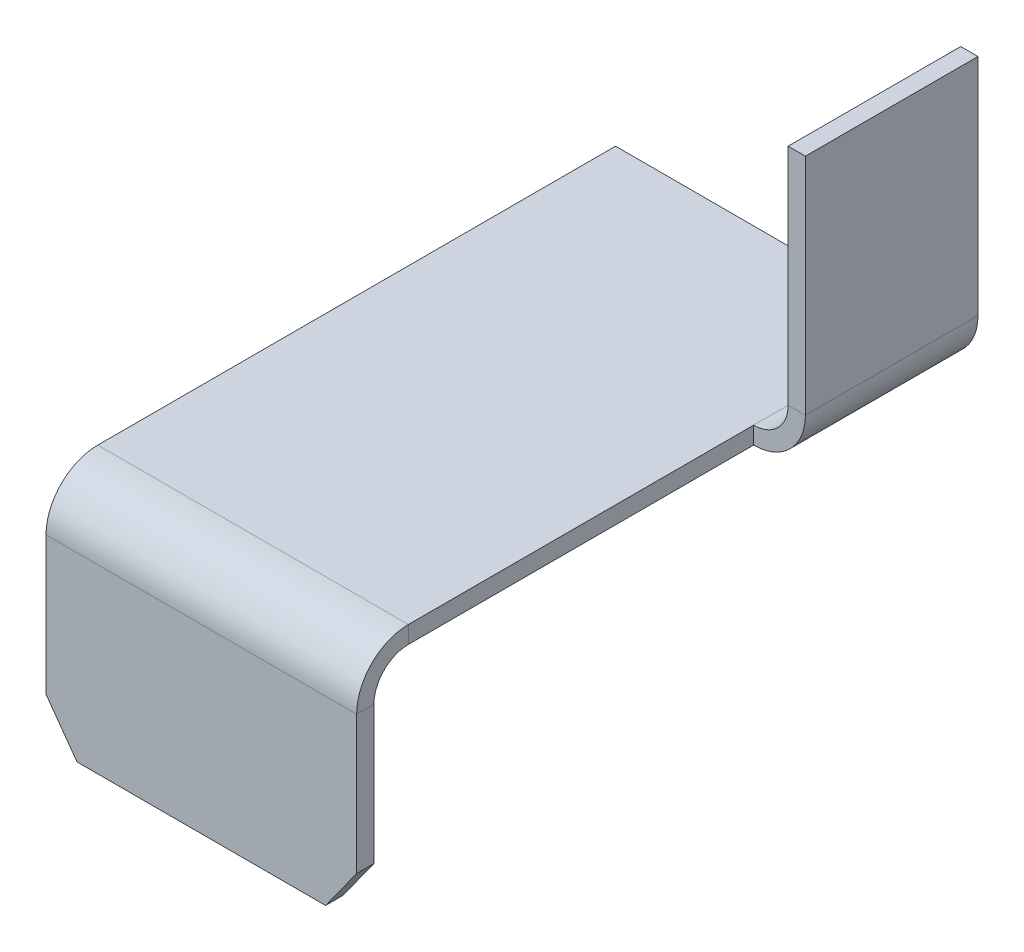
ISO-10303-21;
HEADER;
FILE_DESCRIPTION(('STEP AP214'),'2;1');
FILE_NAME('part.step','',(''),(''),'','','');
FILE_SCHEMA(('AUTOMOTIVE_DESIGN { 1 0 10303 214 1 1 1 1 }'));
ENDSEC;
DATA;
#1=APPLICATION_CONTEXT('core data for automotive mechanical design processes');
#2=APPLICATION_PROTOCOL_DEFINITION('international standard','automotive_design',2000,#1);
#3=PRODUCT_CONTEXT('',#1,'mechanical');
#4=PRODUCT('Part','Part','',(#3));
#5=PRODUCT_RELATED_PRODUCT_CATEGORY('part','',(#4));
#6=PRODUCT_DEFINITION_FORMATION('','',#4);
#7=PRODUCT_DEFINITION_CONTEXT('part definition',#1,'design');
#8=PRODUCT_DEFINITION('design','',#6,#7);
#9=PRODUCT_DEFINITION_SHAPE('','',#8);
#10=(LENGTH_UNIT() NAMED_UNIT(*) SI_UNIT(.MILLI.,.METRE.));
#11=(NAMED_UNIT(*) PLANE_ANGLE_UNIT() SI_UNIT($,.RADIAN.));
#12=(NAMED_UNIT(*) SI_UNIT($,.STERADIAN.) SOLID_ANGLE_UNIT());
#13=UNCERTAINTY_MEASURE_WITH_UNIT(LENGTH_MEASURE(1.E-05),#10,'distance_accuracy_value','');
#14=(GEOMETRIC_REPRESENTATION_CONTEXT(3) GLOBAL_UNCERTAINTY_ASSIGNED_CONTEXT((#13)) GLOBAL_UNIT_ASSIGNED_CONTEXT((#10,
#11,#12)) REPRESENTATION_CONTEXT('',''));
#15=CARTESIAN_POINT('',(0.,0.,0.));
#16=DIRECTION('',(0.,0.,1.));
#17=DIRECTION('',(1.,0.,0.));
#18=AXIS2_PLACEMENT_3D('',#15,#16,#17);
#19=CARTESIAN_POINT('',(20.,2.,10.));
#20=DIRECTION('',(0.,0.,1.));
#21=DIRECTION('',(1.,0.,0.));
#22=AXIS2_PLACEMENT_3D('',#19,#20,#21);
#23=PLANE('',#22);
#24=DIRECTION('',(1.,0.,0.));
#25=VECTOR('',#24,1.);
#26=CARTESIAN_POINT('',(20.,2.,10.));
#27=LINE('',#26,#25);
#28=CARTESIAN_POINT('',(20.,2.,10.));
#29=VERTEX_POINT('',#28);
#30=CARTESIAN_POINT('',(21.,2.,10.));
#31=VERTEX_POINT('',#30);
#32=EDGE_CURVE('E13',#29,#31,#27,.T.);
#33=ORIENTED_EDGE('',*,*,#32,.F.);
#34=CARTESIAN_POINT('',(18.,2.,10.));
#35=DIRECTION('',(0.,0.,-1.));
#36=DIRECTION('',(-1.,0.,0.));
#37=AXIS2_PLACEMENT_3D('',#34,#35,#36);
#38=CIRCLE('',#37,2.);
#39=CARTESIAN_POINT('',(18.,0.,10.));
#40=VERTEX_POINT('',#39);
#41=EDGE_CURVE('E270',#40,#29,#38,.F.);
#42=ORIENTED_EDGE('',*,*,#41,.F.);
#43=DIRECTION('',(0.,1.,0.));
#44=VECTOR('',#43,1.);
#45=CARTESIAN_POINT('',(18.,-1.,10.));
#46=LINE('',#45,#44);
#47=CARTESIAN_POINT('',(18.,-0.999999999999997,10.));
#48=VERTEX_POINT('',#47);
#49=EDGE_CURVE('E78',#48,#40,#46,.T.);
#50=ORIENTED_EDGE('',*,*,#49,.F.);
#51=CARTESIAN_POINT('',(18.,2.,10.));
#52=DIRECTION('',(0.,0.,1.));
#53=DIRECTION('',(1.,0.,0.));
#54=AXIS2_PLACEMENT_3D('',#51,#52,#53);
#55=CIRCLE('',#54,3.);
#56=EDGE_CURVE('E269',#48,#31,#55,.T.);
#57=ORIENTED_EDGE('',*,*,#56,.T.);
#58=EDGE_LOOP('',(#33,#42,#50,#57));
#59=FACE_BOUND('',#58,.T.);
#60=ADVANCED_FACE('F72',(#59),#23,.T.);
#61=CARTESIAN_POINT('',(18.,-1.,10.));
#62=DIRECTION('',(0.,0.,1.));
#63=DIRECTION('',(1.,0.,0.));
#64=AXIS2_PLACEMENT_3D('',#61,#62,#63);
#65=PLANE('',#64);
#66=DIRECTION('',(0.,1.,0.));
#67=VECTOR('',#66,1.);
#68=CARTESIAN_POINT('',(20.,0.,10.));
#69=LINE('',#68,#67);
#70=CARTESIAN_POINT('',(20.,15.,10.));
#71=VERTEX_POINT('',#70);
#72=EDGE_CURVE('E262',#29,#71,#69,.T.);
#73=ORIENTED_EDGE('',*,*,#72,.F.);
#74=ORIENTED_EDGE('',*,*,#32,.T.);
#75=DIRECTION('',(0.,1.,0.));
#76=VECTOR('',#75,1.);
#77=CARTESIAN_POINT('',(21.,0.,10.));
#78=LINE('',#77,#76);
#79=CARTESIAN_POINT('',(21.,15.,10.));
#80=VERTEX_POINT('',#79);
#81=EDGE_CURVE('E127',#31,#80,#78,.T.);
#82=ORIENTED_EDGE('',*,*,#81,.T.);
#83=DIRECTION('',(1.,0.,0.));
#84=VECTOR('',#83,1.);
#85=CARTESIAN_POINT('',(20.,15.,10.));
#86=LINE('',#85,#84);
#87=EDGE_CURVE('E257',#71,#80,#86,.T.);
#88=ORIENTED_EDGE('',*,*,#87,.F.);
#89=EDGE_LOOP('',(#73,#74,#82,#88));
#90=FACE_BOUND('',#89,.T.);
#91=ADVANCED_FACE('F334',(#90),#65,.T.);
#92=CARTESIAN_POINT('',(18.,0.,0.));
#93=DIRECTION('',(0.,0.,-1.));
#94=DIRECTION('',(-1.,0.,0.));
#95=AXIS2_PLACEMENT_3D('',#92,#93,#94);
#96=PLANE('',#95);
#97=DIRECTION('',(0.,-1.,0.));
#98=VECTOR('',#97,1.);
#99=CARTESIAN_POINT('',(18.,0.,0.));
#100=LINE('',#99,#98);
#101=CARTESIAN_POINT('',(18.,0.,0.));
#102=VERTEX_POINT('',#101);
#103=CARTESIAN_POINT('',(18.,-1.,0.));
#104=VERTEX_POINT('',#103);
#105=EDGE_CURVE('E111',#102,#104,#100,.T.);
#106=ORIENTED_EDGE('',*,*,#105,.F.);
#107=CARTESIAN_POINT('',(18.,2.,0.));
#108=DIRECTION('',(0.,0.,-1.));
#109=DIRECTION('',(-1.,0.,0.));
#110=AXIS2_PLACEMENT_3D('',#107,#108,#109);
#111=CIRCLE('',#110,2.);
#112=CARTESIAN_POINT('',(20.,2.,0.));
#113=VERTEX_POINT('',#112);
#114=EDGE_CURVE('E281',#102,#113,#111,.F.);
#115=ORIENTED_EDGE('',*,*,#114,.T.);
#116=DIRECTION('',(-1.,0.,0.));
#117=VECTOR('',#116,1.);
#118=CARTESIAN_POINT('',(21.,2.,0.));
#119=LINE('',#118,#117);
#120=CARTESIAN_POINT('',(21.,2.,0.));
#121=VERTEX_POINT('',#120);
#122=EDGE_CURVE('E122',#121,#113,#119,.T.);
#123=ORIENTED_EDGE('',*,*,#122,.F.);
#124=CARTESIAN_POINT('',(18.,2.,0.));
#125=DIRECTION('',(0.,0.,1.));
#126=DIRECTION('',(1.,0.,0.));
#127=AXIS2_PLACEMENT_3D('',#124,#125,#126);
#128=CIRCLE('',#127,3.);
#129=EDGE_CURVE('E261',#104,#121,#128,.T.);
#130=ORIENTED_EDGE('',*,*,#129,.F.);
#131=EDGE_LOOP('',(#106,#115,#123,#130));
#132=FACE_BOUND('',#131,.T.);
#133=ADVANCED_FACE('F341',(#132),#96,.T.);
#134=CARTESIAN_POINT('',(21.,2.,0.));
#135=DIRECTION('',(0.,0.,-1.));
#136=DIRECTION('',(-1.,0.,0.));
#137=AXIS2_PLACEMENT_3D('',#134,#135,#136);
#138=PLANE('',#137);
#139=DIRECTION('',(1.,0.,0.));
#140=VECTOR('',#139,1.);
#141=CARTESIAN_POINT('',(0.,0.,0.));
#142=LINE('',#141,#140);
#143=CARTESIAN_POINT('',(0.,0.,0.));
#144=VERTEX_POINT('',#143);
#145=EDGE_CURVE('E284',#144,#102,#142,.T.);
#146=ORIENTED_EDGE('',*,*,#145,.T.);
#147=ORIENTED_EDGE('',*,*,#105,.T.);
#148=DIRECTION('',(1.,0.,0.));
#149=VECTOR('',#148,1.);
#150=CARTESIAN_POINT('',(0.,-1.,0.));
#151=LINE('',#150,#149);
#152=CARTESIAN_POINT('',(0.,-1.,0.));
#153=VERTEX_POINT('',#152);
#154=EDGE_CURVE('E290',#153,#104,#151,.T.);
#155=ORIENTED_EDGE('',*,*,#154,.F.);
#156=DIRECTION('',(0.,1.,0.));
#157=VECTOR('',#156,1.);
#158=CARTESIAN_POINT('',(0.,-1.,0.));
#159=LINE('',#158,#157);
#160=EDGE_CURVE('E285',#153,#144,#159,.T.);
#161=ORIENTED_EDGE('',*,*,#160,.T.);
#162=EDGE_LOOP('',(#146,#147,#155,#161));
#163=FACE_BOUND('',#162,.T.);
#164=ADVANCED_FACE('F347',(#163),#138,.T.);
#165=CARTESIAN_POINT('',(21.,0.,10.));
#166=DIRECTION('',(-1.,0.,0.));
#167=DIRECTION('',(0.,0.,1.));
#168=AXIS2_PLACEMENT_3D('',#165,#166,#167);
#169=PLANE('',#168);
#170=DIRECTION('',(0.,1.,0.));
#171=VECTOR('',#170,1.);
#172=CARTESIAN_POINT('',(21.,0.,0.));
#173=LINE('',#172,#171);
#174=CARTESIAN_POINT('',(21.,15.,0.));
#175=VERTEX_POINT('',#174);
#176=EDGE_CURVE('E260',#121,#175,#173,.T.);
#177=ORIENTED_EDGE('',*,*,#176,.T.);
#178=DIRECTION('',(0.,0.,-1.));
#179=VECTOR('',#178,1.);
#180=CARTESIAN_POINT('',(21.,15.,10.));
#181=LINE('',#180,#179);
#182=EDGE_CURVE('E306',#80,#175,#181,.T.);
#183=ORIENTED_EDGE('',*,*,#182,.F.);
#184=ORIENTED_EDGE('',*,*,#81,.F.);
#185=DIRECTION('',(0.,0.,-1.));
#186=VECTOR('',#185,1.);
#187=CARTESIAN_POINT('',(21.,2.,10.));
#188=LINE('',#187,#186);
#189=EDGE_CURVE('E275',#31,#121,#188,.T.);
#190=ORIENTED_EDGE('',*,*,#189,.T.);
#191=EDGE_LOOP('',(#177,#183,#184,#190));
#192=FACE_BOUND('',#191,.T.);
#193=ADVANCED_FACE('F342',(#192),#169,.F.);
#194=CARTESIAN_POINT('',(20.,15.,10.));
#195=DIRECTION('',(0.,1.,0.));
#196=DIRECTION('',(0.,0.,1.));
#197=AXIS2_PLACEMENT_3D('',#194,#195,#196);
#198=PLANE('',#197);
#199=DIRECTION('',(1.,0.,0.));
#200=VECTOR('',#199,1.);
#201=CARTESIAN_POINT('',(20.,15.,0.));
#202=LINE('',#201,#200);
#203=CARTESIAN_POINT('',(20.,15.,0.));
#204=VERTEX_POINT('',#203);
#205=EDGE_CURVE('E274',#204,#175,#202,.T.);
#206=ORIENTED_EDGE('',*,*,#205,.F.);
#207=DIRECTION('',(0.,0.,-1.));
#208=VECTOR('',#207,1.);
#209=CARTESIAN_POINT('',(20.,15.,10.));
#210=LINE('',#209,#208);
#211=EDGE_CURVE('E308',#71,#204,#210,.T.);
#212=ORIENTED_EDGE('',*,*,#211,.F.);
#213=ORIENTED_EDGE('',*,*,#87,.T.);
#214=ORIENTED_EDGE('',*,*,#182,.T.);
#215=EDGE_LOOP('',(#206,#212,#213,#214));
#216=FACE_BOUND('',#215,.T.);
#217=ADVANCED_FACE('F336',(#216),#198,.T.);
#218=CARTESIAN_POINT('',(20.,0.,10.));
#219=DIRECTION('',(-1.,0.,0.));
#220=DIRECTION('',(0.,0.,1.));
#221=AXIS2_PLACEMENT_3D('',#218,#219,#220);
#222=PLANE('',#221);
#223=DIRECTION('',(0.,1.,0.));
#224=VECTOR('',#223,1.);
#225=CARTESIAN_POINT('',(20.,0.,0.));
#226=LINE('',#225,#224);
#227=EDGE_CURVE('E279',#113,#204,#226,.T.);
#228=ORIENTED_EDGE('',*,*,#227,.F.);
#229=DIRECTION('',(0.,0.,-1.));
#230=VECTOR('',#229,1.);
#231=CARTESIAN_POINT('',(20.,2.,10.));
#232=LINE('',#231,#230);
#233=EDGE_CURVE('E305',#29,#113,#232,.T.);
#234=ORIENTED_EDGE('',*,*,#233,.F.);
#235=ORIENTED_EDGE('',*,*,#72,.T.);
#236=ORIENTED_EDGE('',*,*,#211,.T.);
#237=EDGE_LOOP('',(#228,#234,#235,#236));
#238=FACE_BOUND('',#237,.T.);
#239=ADVANCED_FACE('F335',(#238),#222,.T.);
#240=CARTESIAN_POINT('',(18.,2.,10.));
#241=DIRECTION('',(0.,0.,-1.));
#242=DIRECTION('',(-1.,0.,0.));
#243=AXIS2_PLACEMENT_3D('',#240,#241,#242);
#244=CYLINDRICAL_SURFACE('',#243,2.);
#245=ORIENTED_EDGE('',*,*,#114,.F.);
#246=DIRECTION('',(0.,0.,-1.));
#247=VECTOR('',#246,1.);
#248=CARTESIAN_POINT('',(18.,0.,10.));
#249=LINE('',#248,#247);
#250=EDGE_CURVE('E300',#40,#102,#249,.T.);
#251=ORIENTED_EDGE('',*,*,#250,.F.);
#252=ORIENTED_EDGE('',*,*,#41,.T.);
#253=ORIENTED_EDGE('',*,*,#233,.T.);
#254=EDGE_LOOP('',(#245,#251,#252,#253));
#255=FACE_BOUND('',#254,.T.);
#256=ADVANCED_FACE('F322',(#255),#244,.F.);
#257=CARTESIAN_POINT('',(0.,0.,10.));
#258=DIRECTION('',(0.,1.,0.));
#259=DIRECTION('',(0.,0.,1.));
#260=AXIS2_PLACEMENT_3D('',#257,#258,#259);
#261=PLANE('',#260);
#262=ORIENTED_EDGE('',*,*,#145,.F.);
#263=DIRECTION('',(0.,0.,-1.));
#264=VECTOR('',#263,1.);
#265=CARTESIAN_POINT('',(0.,0.,10.));
#266=LINE('',#265,#264);
#267=CARTESIAN_POINT('',(0.,0.,30.));
#268=VERTEX_POINT('',#267);
#269=EDGE_CURVE('E299',#268,#144,#266,.T.);
#270=ORIENTED_EDGE('',*,*,#269,.F.);
#271=DIRECTION('',(-1.,0.,0.));
#272=VECTOR('',#271,1.);
#273=CARTESIAN_POINT('',(0.,0.,30.));
#274=LINE('',#273,#272);
#275=CARTESIAN_POINT('',(18.,0.,30.));
#276=VERTEX_POINT('',#275);
#277=EDGE_CURVE('E192',#268,#276,#274,.F.);
#278=ORIENTED_EDGE('',*,*,#277,.T.);
#279=DIRECTION('',(0.,0.,-1.));
#280=VECTOR('',#279,1.);
#281=CARTESIAN_POINT('',(18.,0.,30.));
#282=LINE('',#281,#280);
#283=EDGE_CURVE('E254',#276,#40,#282,.T.);
#284=ORIENTED_EDGE('',*,*,#283,.T.);
#285=ORIENTED_EDGE('',*,*,#250,.T.);
#286=EDGE_LOOP('',(#262,#270,#278,#284,#285));
#287=FACE_BOUND('',#286,.T.);
#288=ADVANCED_FACE('F366',(#287),#261,.T.);
#289=CARTESIAN_POINT('',(0.,-1.,10.));
#290=DIRECTION('',(-1.,0.,0.));
#291=DIRECTION('',(0.,0.,1.));
#292=AXIS2_PLACEMENT_3D('',#289,#290,#291);
#293=PLANE('',#292);
#294=ORIENTED_EDGE('',*,*,#160,.F.);
#295=DIRECTION('',(0.,0.,-1.));
#296=VECTOR('',#295,1.);
#297=CARTESIAN_POINT('',(0.,-1.,10.));
#298=LINE('',#297,#296);
#299=CARTESIAN_POINT('',(0.,-0.999999999999997,30.));
#300=VERTEX_POINT('',#299);
#301=EDGE_CURVE('E296',#300,#153,#298,.T.);
#302=ORIENTED_EDGE('',*,*,#301,.F.);
#303=DIRECTION('',(0.,1.,0.));
#304=VECTOR('',#303,1.);
#305=CARTESIAN_POINT('',(0.,-0.999999999999997,30.));
#306=LINE('',#305,#304);
#307=EDGE_CURVE('E242',#300,#268,#306,.T.);
#308=ORIENTED_EDGE('',*,*,#307,.T.);
#309=ORIENTED_EDGE('',*,*,#269,.T.);
#310=EDGE_LOOP('',(#294,#302,#308,#309));
#311=FACE_BOUND('',#310,.T.);
#312=ADVANCED_FACE('F380',(#311),#293,.T.);
#313=CARTESIAN_POINT('',(0.,-1.,10.));
#314=DIRECTION('',(0.,1.,0.));
#315=DIRECTION('',(0.,0.,1.));
#316=AXIS2_PLACEMENT_3D('',#313,#314,#315);
#317=PLANE('',#316);
#318=ORIENTED_EDGE('',*,*,#154,.T.);
#319=DIRECTION('',(0.,0.,-1.));
#320=VECTOR('',#319,1.);
#321=CARTESIAN_POINT('',(18.,-1.,10.));
#322=LINE('',#321,#320);
#323=EDGE_CURVE('E291',#48,#104,#322,.T.);
#324=ORIENTED_EDGE('',*,*,#323,.F.);
#325=DIRECTION('',(0.,0.,-1.));
#326=VECTOR('',#325,1.);
#327=CARTESIAN_POINT('',(18.,-0.999999999999997,30.));
#328=LINE('',#327,#326);
#329=CARTESIAN_POINT('',(18.,-0.999999999999997,30.));
#330=VERTEX_POINT('',#329);
#331=EDGE_CURVE('E252',#330,#48,#328,.T.);
#332=ORIENTED_EDGE('',*,*,#331,.F.);
#333=DIRECTION('',(-1.,0.,0.));
#334=VECTOR('',#333,1.);
#335=CARTESIAN_POINT('',(0.,-0.999999999999997,30.));
#336=LINE('',#335,#334);
#337=EDGE_CURVE('E247',#300,#330,#336,.F.);
#338=ORIENTED_EDGE('',*,*,#337,.F.);
#339=ORIENTED_EDGE('',*,*,#301,.T.);
#340=EDGE_LOOP('',(#318,#324,#332,#338,#339));
#341=FACE_BOUND('',#340,.T.);
#342=ADVANCED_FACE('F387',(#341),#317,.F.);
#343=CARTESIAN_POINT('',(18.,2.,10.));
#344=DIRECTION('',(0.,0.,-1.));
#345=DIRECTION('',(-1.,0.,0.));
#346=AXIS2_PLACEMENT_3D('',#343,#344,#345);
#347=CYLINDRICAL_SURFACE('',#346,3.);
#348=ORIENTED_EDGE('',*,*,#129,.T.);
#349=ORIENTED_EDGE('',*,*,#189,.F.);
#350=ORIENTED_EDGE('',*,*,#56,.F.);
#351=ORIENTED_EDGE('',*,*,#323,.T.);
#352=EDGE_LOOP('',(#348,#349,#350,#351));
#353=FACE_BOUND('',#352,.T.);
#354=ADVANCED_FACE('F345',(#353),#347,.T.);
#355=CARTESIAN_POINT('',(18.,2.,0.));
#356=DIRECTION('',(0.,0.,-1.));
#357=DIRECTION('',(-1.,0.,0.));
#358=AXIS2_PLACEMENT_3D('',#355,#356,#357);
#359=PLANE('',#358);
#360=ORIENTED_EDGE('',*,*,#176,.F.);
#361=ORIENTED_EDGE('',*,*,#122,.T.);
#362=ORIENTED_EDGE('',*,*,#227,.T.);
#363=ORIENTED_EDGE('',*,*,#205,.T.);
#364=EDGE_LOOP('',(#360,#361,#362,#363));
#365=FACE_BOUND('',#364,.T.);
#366=ADVANCED_FACE('F338',(#365),#359,.T.);
#367=CARTESIAN_POINT('',(18.,-0.999999999999997,30.));
#368=DIRECTION('',(-1.,0.,0.));
#369=DIRECTION('',(0.,1.,0.));
#370=AXIS2_PLACEMENT_3D('',#367,#368,#369);
#371=PLANE('',#370);
#372=ORIENTED_EDGE('',*,*,#283,.F.);
#373=DIRECTION('',(0.,1.,0.));
#374=VECTOR('',#373,1.);
#375=CARTESIAN_POINT('',(18.,-0.999999999999997,30.));
#376=LINE('',#375,#374);
#377=EDGE_CURVE('E246',#330,#276,#376,.T.);
#378=ORIENTED_EDGE('',*,*,#377,.F.);
#379=ORIENTED_EDGE('',*,*,#331,.T.);
#380=ORIENTED_EDGE('',*,*,#49,.T.);
#381=EDGE_LOOP('',(#372,#378,#379,#380));
#382=FACE_BOUND('',#381,.T.);
#383=ADVANCED_FACE('F316',(#382),#371,.F.);
#384=CARTESIAN_POINT('',(18.,-3.,30.));
#385=DIRECTION('',(1.,0.,0.));
#386=DIRECTION('',(0.,0.,-1.));
#387=AXIS2_PLACEMENT_3D('',#384,#385,#386);
#388=PLANE('',#387);
#389=DIRECTION('',(0.,0.,-1.));
#390=VECTOR('',#389,1.);
#391=CARTESIAN_POINT('',(18.,-3.,33.));
#392=LINE('',#391,#390);
#393=CARTESIAN_POINT('',(18.,-3.,32.));
#394=VERTEX_POINT('',#393);
#395=CARTESIAN_POINT('',(18.,-3.,33.));
#396=VERTEX_POINT('',#395);
#397=EDGE_CURVE('E240',#394,#396,#392,.F.);
#398=ORIENTED_EDGE('',*,*,#397,.F.);
#399=CARTESIAN_POINT('',(18.,-3.,30.));
#400=DIRECTION('',(-1.,0.,0.));
#401=DIRECTION('',(0.,0.,1.));
#402=AXIS2_PLACEMENT_3D('',#399,#400,#401);
#403=CIRCLE('',#402,2.);
#404=EDGE_CURVE('E191',#330,#394,#403,.F.);
#405=ORIENTED_EDGE('',*,*,#404,.F.);
#406=ORIENTED_EDGE('',*,*,#377,.T.);
#407=CARTESIAN_POINT('',(18.,-3.,30.));
#408=DIRECTION('',(-1.,0.,0.));
#409=DIRECTION('',(0.,0.,1.));
#410=AXIS2_PLACEMENT_3D('',#407,#408,#409);
#411=CIRCLE('',#410,3.);
#412=EDGE_CURVE('E241',#276,#396,#411,.F.);
#413=ORIENTED_EDGE('',*,*,#412,.T.);
#414=EDGE_LOOP('',(#398,#405,#406,#413));
#415=FACE_BOUND('',#414,.T.);
#416=ADVANCED_FACE('F408',(#415),#388,.T.);
#417=CARTESIAN_POINT('',(0.,-3.,30.));
#418=DIRECTION('',(1.,0.,0.));
#419=DIRECTION('',(0.,0.,-1.));
#420=AXIS2_PLACEMENT_3D('',#417,#418,#419);
#421=PLANE('',#420);
#422=CARTESIAN_POINT('',(0.,-3.,30.));
#423=DIRECTION('',(-1.,0.,0.));
#424=DIRECTION('',(0.,0.,1.));
#425=AXIS2_PLACEMENT_3D('',#422,#423,#424);
#426=CIRCLE('',#425,2.);
#427=CARTESIAN_POINT('',(0.,-3.,32.));
#428=VERTEX_POINT('',#427);
#429=EDGE_CURVE('E203',#428,#300,#426,.T.);
#430=ORIENTED_EDGE('',*,*,#429,.F.);
#431=DIRECTION('',(0.,0.,-1.));
#432=VECTOR('',#431,1.);
#433=CARTESIAN_POINT('',(0.,-3.,32.));
#434=LINE('',#433,#432);
#435=CARTESIAN_POINT('',(0.,-3.,33.));
#436=VERTEX_POINT('',#435);
#437=EDGE_CURVE('E196',#428,#436,#434,.F.);
#438=ORIENTED_EDGE('',*,*,#437,.T.);
#439=CARTESIAN_POINT('',(0.,-3.,30.));
#440=DIRECTION('',(-1.,0.,0.));
#441=DIRECTION('',(0.,0.,1.));
#442=AXIS2_PLACEMENT_3D('',#439,#440,#441);
#443=CIRCLE('',#442,3.);
#444=EDGE_CURVE('E184',#436,#268,#443,.T.);
#445=ORIENTED_EDGE('',*,*,#444,.T.);
#446=ORIENTED_EDGE('',*,*,#307,.F.);
#447=EDGE_LOOP('',(#430,#438,#445,#446));
#448=FACE_BOUND('',#447,.T.);
#449=ADVANCED_FACE('F200',(#448),#421,.F.);
#450=CARTESIAN_POINT('',(0.,-3.,30.));
#451=DIRECTION('',(-1.,0.,0.));
#452=DIRECTION('',(0.,0.,1.));
#453=AXIS2_PLACEMENT_3D('',#450,#451,#452);
#454=CYLINDRICAL_SURFACE('',#453,3.);
#455=ORIENTED_EDGE('',*,*,#277,.F.);
#456=ORIENTED_EDGE('',*,*,#444,.F.);
#457=DIRECTION('',(-1.,0.,0.));
#458=VECTOR('',#457,1.);
#459=CARTESIAN_POINT('',(0.,-3.,33.));
#460=LINE('',#459,#458);
#461=EDGE_CURVE('E189',#396,#436,#460,.T.);
#462=ORIENTED_EDGE('',*,*,#461,.F.);
#463=ORIENTED_EDGE('',*,*,#412,.F.);
#464=EDGE_LOOP('',(#455,#456,#462,#463));
#465=FACE_BOUND('',#464,.T.);
#466=ADVANCED_FACE('F186',(#465),#454,.T.);
#467=CARTESIAN_POINT('',(0.,-3.,30.));
#468=DIRECTION('',(-1.,0.,0.));
#469=DIRECTION('',(0.,0.,1.));
#470=AXIS2_PLACEMENT_3D('',#467,#468,#469);
#471=CYLINDRICAL_SURFACE('',#470,2.);
#472=ORIENTED_EDGE('',*,*,#337,.T.);
#473=ORIENTED_EDGE('',*,*,#404,.T.);
#474=DIRECTION('',(1.,0.,0.));
#475=VECTOR('',#474,1.);
#476=CARTESIAN_POINT('',(18.,-3.,32.));
#477=LINE('',#476,#475);
#478=EDGE_CURVE('E202',#394,#428,#477,.F.);
#479=ORIENTED_EDGE('',*,*,#478,.T.);
#480=ORIENTED_EDGE('',*,*,#429,.T.);
#481=EDGE_LOOP('',(#472,#473,#479,#480));
#482=FACE_BOUND('',#481,.T.);
#483=ADVANCED_FACE('F435',(#482),#471,.F.);
#484=CARTESIAN_POINT('',(0.,-1.,33.));
#485=DIRECTION('',(1.,0.,0.));
#486=DIRECTION('',(0.,0.,-1.));
#487=AXIS2_PLACEMENT_3D('',#484,#485,#486);
#488=PLANE('',#487);
#489=ORIENTED_EDGE('',*,*,#437,.F.);
#490=DIRECTION('',(0.,-1.,0.));
#491=VECTOR('',#490,1.);
#492=CARTESIAN_POINT('',(0.,-1.,32.));
#493=LINE('',#492,#491);
#494=CARTESIAN_POINT('',(0.,-11.,32.));
#495=VERTEX_POINT('',#494);
#496=EDGE_CURVE('E212',#428,#495,#493,.T.);
#497=ORIENTED_EDGE('',*,*,#496,.T.);
#498=DIRECTION('',(0.,0.,-1.));
#499=VECTOR('',#498,1.);
#500=CARTESIAN_POINT('',(0.,-11.,33.));
#501=LINE('',#500,#499);
#502=CARTESIAN_POINT('',(0.,-11.,33.));
#503=VERTEX_POINT('',#502);
#504=EDGE_CURVE('E218',#503,#495,#501,.T.);
#505=ORIENTED_EDGE('',*,*,#504,.F.);
#506=DIRECTION('',(0.,1.,0.));
#507=VECTOR('',#506,1.);
#508=CARTESIAN_POINT('',(0.,0.,33.));
#509=LINE('',#508,#507);
#510=EDGE_CURVE('E209',#436,#503,#509,.F.);
#511=ORIENTED_EDGE('',*,*,#510,.F.);
#512=EDGE_LOOP('',(#489,#497,#505,#511));
#513=FACE_BOUND('',#512,.T.);
#514=ADVANCED_FACE('F220',(#513),#488,.F.);
#515=CARTESIAN_POINT('',(18.,-1.,33.));
#516=DIRECTION('',(-1.,0.,0.));
#517=DIRECTION('',(0.,0.,1.));
#518=AXIS2_PLACEMENT_3D('',#515,#516,#517);
#519=PLANE('',#518);
#520=ORIENTED_EDGE('',*,*,#397,.T.);
#521=DIRECTION('',(0.,-1.,0.));
#522=VECTOR('',#521,1.);
#523=CARTESIAN_POINT('',(18.,0.,33.));
#524=LINE('',#523,#522);
#525=CARTESIAN_POINT('',(18.,-11.,33.));
#526=VERTEX_POINT('',#525);
#527=EDGE_CURVE('E213',#526,#396,#524,.F.);
#528=ORIENTED_EDGE('',*,*,#527,.F.);
#529=DIRECTION('',(0.,0.,-1.));
#530=VECTOR('',#529,1.);
#531=CARTESIAN_POINT('',(18.,-11.,33.));
#532=LINE('',#531,#530);
#533=CARTESIAN_POINT('',(18.,-11.,32.));
#534=VERTEX_POINT('',#533);
#535=EDGE_CURVE('E622',#526,#534,#532,.T.);
#536=ORIENTED_EDGE('',*,*,#535,.T.);
#537=DIRECTION('',(0.,1.,0.));
#538=VECTOR('',#537,1.);
#539=CARTESIAN_POINT('',(18.,-1.,32.));
#540=LINE('',#539,#538);
#541=EDGE_CURVE('E222',#534,#394,#540,.T.);
#542=ORIENTED_EDGE('',*,*,#541,.T.);
#543=EDGE_LOOP('',(#520,#528,#536,#542));
#544=FACE_BOUND('',#543,.T.);
#545=ADVANCED_FACE('F449',(#544),#519,.F.);
#546=CARTESIAN_POINT('',(0.,0.,33.));
#547=DIRECTION('',(0.,0.,1.));
#548=DIRECTION('',(1.,0.,0.));
#549=AXIS2_PLACEMENT_3D('',#546,#547,#548);
#550=PLANE('',#549);
#551=ORIENTED_EDGE('',*,*,#527,.T.);
#552=ORIENTED_EDGE('',*,*,#461,.T.);
#553=ORIENTED_EDGE('',*,*,#510,.T.);
#554=DIRECTION('',(-0.584304725845076,0.811534341451495,0.));
#555=VECTOR('',#554,1.);
#556=CARTESIAN_POINT('',(-5.21601685985248,-3.75553213909378,33.));
#557=LINE('',#556,#555);
#558=CARTESIAN_POINT('',(1.8,-13.5,33.));
#559=VERTEX_POINT('',#558);
#560=EDGE_CURVE('E219',#503,#559,#557,.F.);
#561=ORIENTED_EDGE('',*,*,#560,.T.);
#562=DIRECTION('',(-1.,0.,0.));
#563=VECTOR('',#562,1.);
#564=CARTESIAN_POINT('',(0.,-13.5,33.));
#565=LINE('',#564,#563);
#566=CARTESIAN_POINT('',(16.2,-13.5,33.));
#567=VERTEX_POINT('',#566);
#568=EDGE_CURVE('E224',#559,#567,#565,.F.);
#569=ORIENTED_EDGE('',*,*,#568,.T.);
#570=DIRECTION('',(-0.584304725845076,-0.811534341451495,0.));
#571=VECTOR('',#570,1.);
#572=CARTESIAN_POINT('',(17.0706006322445,-12.290832455216,33.));
#573=LINE('',#572,#571);
#574=EDGE_CURVE('E643',#567,#526,#573,.F.);
#575=ORIENTED_EDGE('',*,*,#574,.T.);
#576=EDGE_LOOP('',(#551,#552,#553,#561,#569,#575));
#577=FACE_BOUND('',#576,.T.);
#578=ADVANCED_FACE('F207',(#577),#550,.T.);
#579=CARTESIAN_POINT('',(0.,0.,32.));
#580=DIRECTION('',(0.,0.,1.));
#581=DIRECTION('',(1.,0.,0.));
#582=AXIS2_PLACEMENT_3D('',#579,#580,#581);
#583=PLANE('',#582);
#584=ORIENTED_EDGE('',*,*,#478,.F.);
#585=ORIENTED_EDGE('',*,*,#541,.F.);
#586=DIRECTION('',(0.584304725845076,0.811534341451495,0.));
#587=VECTOR('',#586,1.);
#588=CARTESIAN_POINT('',(16.2,-13.5,32.));
#589=LINE('',#588,#587);
#590=CARTESIAN_POINT('',(16.2,-13.5,32.));
#591=VERTEX_POINT('',#590);
#592=EDGE_CURVE('E226',#591,#534,#589,.T.);
#593=ORIENTED_EDGE('',*,*,#592,.F.);
#594=DIRECTION('',(1.,0.,0.));
#595=VECTOR('',#594,1.);
#596=CARTESIAN_POINT('',(1.8,-13.5,32.));
#597=LINE('',#596,#595);
#598=CARTESIAN_POINT('',(1.8,-13.5,32.));
#599=VERTEX_POINT('',#598);
#600=EDGE_CURVE('E232',#599,#591,#597,.T.);
#601=ORIENTED_EDGE('',*,*,#600,.F.);
#602=DIRECTION('',(0.584304725845076,-0.811534341451495,0.));
#603=VECTOR('',#602,1.);
#604=CARTESIAN_POINT('',(0.,-11.,32.));
#605=LINE('',#604,#603);
#606=EDGE_CURVE('E235',#495,#599,#605,.T.);
#607=ORIENTED_EDGE('',*,*,#606,.F.);
#608=ORIENTED_EDGE('',*,*,#496,.F.);
#609=EDGE_LOOP('',(#584,#585,#593,#601,#607,#608));
#610=FACE_BOUND('',#609,.T.);
#611=ADVANCED_FACE('F463',(#610),#583,.F.);
#612=CARTESIAN_POINT('',(0.,-11.,33.));
#613=DIRECTION('',(0.811534341451495,0.584304725845076,0.));
#614=DIRECTION('',(-0.584304725845076,0.811534341451495,0.));
#615=AXIS2_PLACEMENT_3D('',#612,#613,#614);
#616=PLANE('',#615);
#617=ORIENTED_EDGE('',*,*,#606,.T.);
#618=DIRECTION('',(0.,0.,-1.));
#619=VECTOR('',#618,1.);
#620=CARTESIAN_POINT('',(1.8,-13.5,33.));
#621=LINE('',#620,#619);
#622=EDGE_CURVE('E633',#559,#599,#621,.T.);
#623=ORIENTED_EDGE('',*,*,#622,.F.);
#624=ORIENTED_EDGE('',*,*,#560,.F.);
#625=ORIENTED_EDGE('',*,*,#504,.T.);
#626=EDGE_LOOP('',(#617,#623,#624,#625));
#627=FACE_BOUND('',#626,.T.);
#628=ADVANCED_FACE('F472',(#627),#616,.F.);
#629=CARTESIAN_POINT('',(1.8,-13.5,33.));
#630=DIRECTION('',(0.,1.,0.));
#631=DIRECTION('',(0.,0.,1.));
#632=AXIS2_PLACEMENT_3D('',#629,#630,#631);
#633=PLANE('',#632);
#634=ORIENTED_EDGE('',*,*,#600,.T.);
#635=DIRECTION('',(0.,0.,-1.));
#636=VECTOR('',#635,1.);
#637=CARTESIAN_POINT('',(16.2,-13.5,33.));
#638=LINE('',#637,#636);
#639=EDGE_CURVE('E621',#567,#591,#638,.T.);
#640=ORIENTED_EDGE('',*,*,#639,.F.);
#641=ORIENTED_EDGE('',*,*,#568,.F.);
#642=ORIENTED_EDGE('',*,*,#622,.T.);
#643=EDGE_LOOP('',(#634,#640,#641,#642));
#644=FACE_BOUND('',#643,.T.);
#645=ADVANCED_FACE('F481',(#644),#633,.F.);
#646=CARTESIAN_POINT('',(16.2,-13.5,33.));
#647=DIRECTION('',(-0.811534341451495,0.584304725845076,0.));
#648=DIRECTION('',(-0.584304725845076,-0.811534341451495,0.));
#649=AXIS2_PLACEMENT_3D('',#646,#647,#648);
#650=PLANE('',#649);
#651=ORIENTED_EDGE('',*,*,#592,.T.);
#652=ORIENTED_EDGE('',*,*,#535,.F.);
#653=ORIENTED_EDGE('',*,*,#574,.F.);
#654=ORIENTED_EDGE('',*,*,#639,.T.);
#655=EDGE_LOOP('',(#651,#652,#653,#654));
#656=FACE_BOUND('',#655,.T.);
#657=ADVANCED_FACE('F489',(#656),#650,.F.);
#658=CLOSED_SHELL('',(#60,#91,#133,#164,#193,#217,#239,#256,#288,#312,#342,#354,#366,#383,#416,
#449,#466,#483,#514,#545,#578,#611,#628,#645,#657));
#659=MANIFOLD_SOLID_BREP('B2',#658);
#660=ADVANCED_BREP_SHAPE_REPRESENTATION('',(#18,#659),#14);
#661=SHAPE_DEFINITION_REPRESENTATION(#9,#660);
ENDSEC;
END-ISO-10303-21;
